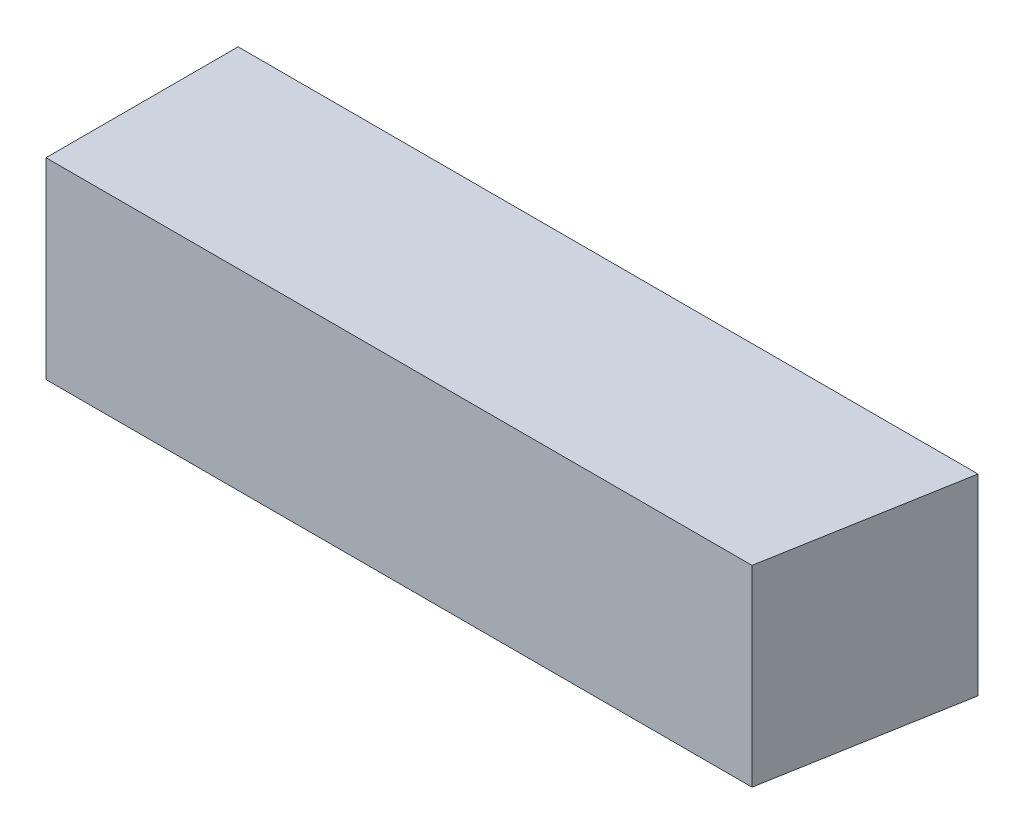
ISO-10303-21;
HEADER;
FILE_DESCRIPTION(('STEP AP214'),'2;1');
FILE_NAME('part.step','',(''),(''),'','','');
FILE_SCHEMA(('AUTOMOTIVE_DESIGN { 1 0 10303 214 1 1 1 1 }'));
ENDSEC;
DATA;
#1=APPLICATION_CONTEXT('core data for automotive mechanical design processes');
#2=APPLICATION_PROTOCOL_DEFINITION('international standard','automotive_design',2000,#1);
#3=PRODUCT_CONTEXT('',#1,'mechanical');
#4=PRODUCT('Part','Part','',(#3));
#5=PRODUCT_RELATED_PRODUCT_CATEGORY('part','',(#4));
#6=PRODUCT_DEFINITION_FORMATION('','',#4);
#7=PRODUCT_DEFINITION_CONTEXT('part definition',#1,'design');
#8=PRODUCT_DEFINITION('design','',#6,#7);
#9=PRODUCT_DEFINITION_SHAPE('','',#8);
#10=(LENGTH_UNIT() NAMED_UNIT(*) SI_UNIT(.MILLI.,.METRE.));
#11=(NAMED_UNIT(*) PLANE_ANGLE_UNIT() SI_UNIT($,.RADIAN.));
#12=(NAMED_UNIT(*) SI_UNIT($,.STERADIAN.) SOLID_ANGLE_UNIT());
#13=UNCERTAINTY_MEASURE_WITH_UNIT(LENGTH_MEASURE(1.E-05),#10,'distance_accuracy_value','');
#14=(GEOMETRIC_REPRESENTATION_CONTEXT(3) GLOBAL_UNCERTAINTY_ASSIGNED_CONTEXT((#13)) GLOBAL_UNIT_ASSIGNED_CONTEXT((#10,
#11,#12)) REPRESENTATION_CONTEXT('',''));
#15=CARTESIAN_POINT('',(0.,0.,0.));
#16=DIRECTION('',(0.,0.,1.));
#17=DIRECTION('',(1.,0.,0.));
#18=AXIS2_PLACEMENT_3D('',#15,#16,#17);
#19=CARTESIAN_POINT('',(342.392,0.,0.));
#20=DIRECTION('',(0.,1.,0.));
#21=DIRECTION('',(0.,0.,1.));
#22=AXIS2_PLACEMENT_3D('',#19,#20,#21);
#23=PLANE('',#22);
#24=DIRECTION('',(-0.173622407885694,0.,0.984812296572283));
#25=VECTOR('',#24,1.);
#26=CARTESIAN_POINT('',(342.392,0.,0.));
#27=LINE('',#26,#25);
#28=CARTESIAN_POINT('',(342.392,0.,0.));
#29=VERTEX_POINT('',#28);
#30=CARTESIAN_POINT('',(326.71893,0.,88.9));
#31=VERTEX_POINT('',#30);
#32=EDGE_CURVE('E61',#29,#31,#27,.T.);
#33=ORIENTED_EDGE('',*,*,#32,.T.);
#34=DIRECTION('',(-1.,0.,0.));
#35=VECTOR('',#34,1.);
#36=CARTESIAN_POINT('',(342.392,0.,88.9));
#37=LINE('',#36,#35);
#38=CARTESIAN_POINT('',(0.,0.,88.9));
#39=VERTEX_POINT('',#38);
#40=EDGE_CURVE('E91',#31,#39,#37,.T.);
#41=ORIENTED_EDGE('',*,*,#40,.T.);
#42=DIRECTION('',(0.,0.,-1.));
#43=VECTOR('',#42,1.);
#44=CARTESIAN_POINT('',(0.,0.,0.));
#45=LINE('',#44,#43);
#46=CARTESIAN_POINT('',(0.,0.,0.));
#47=VERTEX_POINT('',#46);
#48=EDGE_CURVE('E104',#39,#47,#45,.T.);
#49=ORIENTED_EDGE('',*,*,#48,.T.);
#50=DIRECTION('',(-1.,0.,0.));
#51=VECTOR('',#50,1.);
#52=CARTESIAN_POINT('',(342.392,0.,0.));
#53=LINE('',#52,#51);
#54=EDGE_CURVE('E11',#29,#47,#53,.T.);
#55=ORIENTED_EDGE('',*,*,#54,.F.);
#56=EDGE_LOOP('',(#33,#41,#49,#55));
#57=FACE_BOUND('',#56,.T.);
#58=ADVANCED_FACE('F45',(#57),#23,.F.);
#59=CARTESIAN_POINT('',(342.392,88.9,0.));
#60=DIRECTION('',(0.,-1.,0.));
#61=DIRECTION('',(0.,0.,-1.));
#62=AXIS2_PLACEMENT_3D('',#59,#60,#61);
#63=PLANE('',#62);
#64=DIRECTION('',(-0.173622407885694,0.,0.984812296572283));
#65=VECTOR('',#64,1.);
#66=CARTESIAN_POINT('',(342.392,88.9,0.));
#67=LINE('',#66,#65);
#68=CARTESIAN_POINT('',(342.392,88.9,0.));
#69=VERTEX_POINT('',#68);
#70=CARTESIAN_POINT('',(326.71893,88.9,88.9));
#71=VERTEX_POINT('',#70);
#72=EDGE_CURVE('E119',#69,#71,#67,.T.);
#73=ORIENTED_EDGE('',*,*,#72,.F.);
#74=DIRECTION('',(-1.,0.,0.));
#75=VECTOR('',#74,1.);
#76=CARTESIAN_POINT('',(342.392,88.9,0.));
#77=LINE('',#76,#75);
#78=CARTESIAN_POINT('',(0.,88.9,0.));
#79=VERTEX_POINT('',#78);
#80=EDGE_CURVE('E54',#69,#79,#77,.T.);
#81=ORIENTED_EDGE('',*,*,#80,.T.);
#82=DIRECTION('',(0.,0.,1.));
#83=VECTOR('',#82,1.);
#84=CARTESIAN_POINT('',(0.,88.9,0.));
#85=LINE('',#84,#83);
#86=CARTESIAN_POINT('',(0.,88.9,88.9));
#87=VERTEX_POINT('',#86);
#88=EDGE_CURVE('E95',#79,#87,#85,.T.);
#89=ORIENTED_EDGE('',*,*,#88,.T.);
#90=DIRECTION('',(-1.,0.,0.));
#91=VECTOR('',#90,1.);
#92=CARTESIAN_POINT('',(342.392,88.9,88.9));
#93=LINE('',#92,#91);
#94=EDGE_CURVE('E80',#71,#87,#93,.T.);
#95=ORIENTED_EDGE('',*,*,#94,.F.);
#96=EDGE_LOOP('',(#73,#81,#89,#95));
#97=FACE_BOUND('',#96,.T.);
#98=ADVANCED_FACE('F96',(#97),#63,.F.);
#99=CARTESIAN_POINT('',(342.392,0.,88.9));
#100=DIRECTION('',(0.,0.,-1.));
#101=DIRECTION('',(-1.,0.,0.));
#102=AXIS2_PLACEMENT_3D('',#99,#100,#101);
#103=PLANE('',#102);
#104=DIRECTION('',(0.,-1.,0.));
#105=VECTOR('',#104,1.);
#106=CARTESIAN_POINT('',(326.71893,88.9,88.9));
#107=LINE('',#106,#105);
#108=EDGE_CURVE('E87',#71,#31,#107,.T.);
#109=ORIENTED_EDGE('',*,*,#108,.F.);
#110=ORIENTED_EDGE('',*,*,#94,.T.);
#111=DIRECTION('',(0.,-1.,0.));
#112=VECTOR('',#111,1.);
#113=CARTESIAN_POINT('',(0.,0.,88.9));
#114=LINE('',#113,#112);
#115=EDGE_CURVE('E85',#87,#39,#114,.T.);
#116=ORIENTED_EDGE('',*,*,#115,.T.);
#117=ORIENTED_EDGE('',*,*,#40,.F.);
#118=EDGE_LOOP('',(#109,#110,#116,#117));
#119=FACE_BOUND('',#118,.T.);
#120=ADVANCED_FACE('F82',(#119),#103,.F.);
#121=CARTESIAN_POINT('',(342.392,0.,0.));
#122=DIRECTION('',(0.,0.,1.));
#123=DIRECTION('',(1.,0.,0.));
#124=AXIS2_PLACEMENT_3D('',#121,#122,#123);
#125=PLANE('',#124);
#126=DIRECTION('',(0.,1.,0.));
#127=VECTOR('',#126,1.);
#128=CARTESIAN_POINT('',(0.,0.,0.));
#129=LINE('',#128,#127);
#130=EDGE_CURVE('E100',#47,#79,#129,.T.);
#131=ORIENTED_EDGE('',*,*,#130,.T.);
#132=ORIENTED_EDGE('',*,*,#80,.F.);
#133=DIRECTION('',(0.,1.,0.));
#134=VECTOR('',#133,1.);
#135=CARTESIAN_POINT('',(342.392,0.,0.));
#136=LINE('',#135,#134);
#137=EDGE_CURVE('E106',#29,#69,#136,.T.);
#138=ORIENTED_EDGE('',*,*,#137,.F.);
#139=ORIENTED_EDGE('',*,*,#54,.T.);
#140=EDGE_LOOP('',(#131,#132,#138,#139));
#141=FACE_BOUND('',#140,.T.);
#142=ADVANCED_FACE('F131',(#141),#125,.F.);
#143=CARTESIAN_POINT('',(0.,0.,0.));
#144=DIRECTION('',(-1.,0.,0.));
#145=DIRECTION('',(0.,0.,1.));
#146=AXIS2_PLACEMENT_3D('',#143,#144,#145);
#147=PLANE('',#146);
#148=ORIENTED_EDGE('',*,*,#48,.F.);
#149=ORIENTED_EDGE('',*,*,#115,.F.);
#150=ORIENTED_EDGE('',*,*,#88,.F.);
#151=ORIENTED_EDGE('',*,*,#130,.F.);
#152=EDGE_LOOP('',(#148,#149,#150,#151));
#153=FACE_BOUND('',#152,.T.);
#154=ADVANCED_FACE('F102',(#153),#147,.T.);
#155=CARTESIAN_POINT('',(342.392,88.9,0.));
#156=DIRECTION('',(0.984812296572283,0.,0.173622407885694));
#157=DIRECTION('',(0.173622407885694,0.,-0.984812296572283));
#158=AXIS2_PLACEMENT_3D('',#155,#156,#157);
#159=PLANE('',#158);
#160=ORIENTED_EDGE('',*,*,#32,.F.);
#161=ORIENTED_EDGE('',*,*,#137,.T.);
#162=ORIENTED_EDGE('',*,*,#72,.T.);
#163=ORIENTED_EDGE('',*,*,#108,.T.);
#164=EDGE_LOOP('',(#160,#161,#162,#163));
#165=FACE_BOUND('',#164,.T.);
#166=ADVANCED_FACE('F120',(#165),#159,.T.);
#167=CLOSED_SHELL('',(#58,#98,#120,#142,#154,#166));
#168=MANIFOLD_SOLID_BREP('B2',#167);
#169=ADVANCED_BREP_SHAPE_REPRESENTATION('',(#18,#168),#14);
#170=SHAPE_DEFINITION_REPRESENTATION(#9,#169);
ENDSEC;
END-ISO-10303-21;
